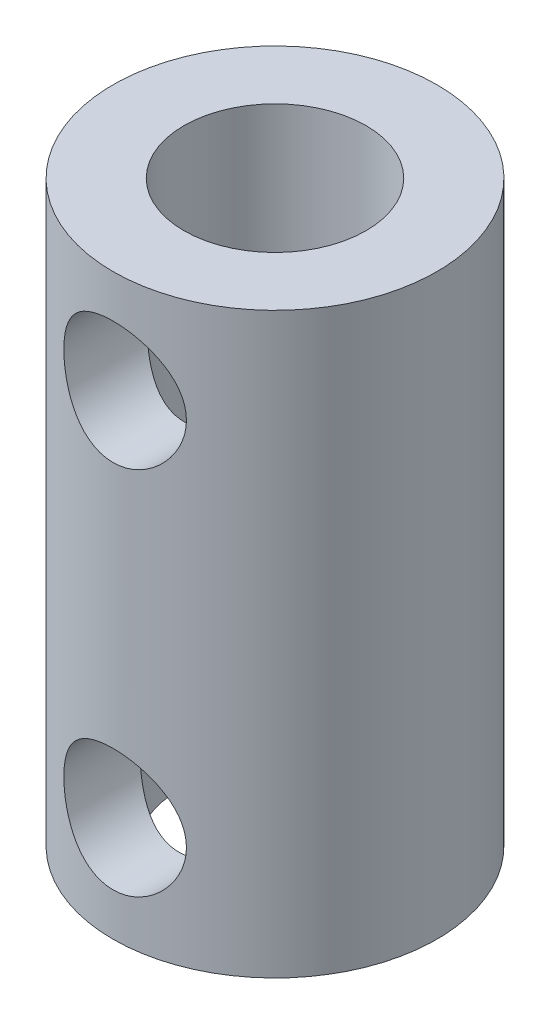
ISO-10303-21;
HEADER;
FILE_DESCRIPTION(('STEP AP214'),'2;1');
FILE_NAME('part.step','',(''),(''),'','','');
FILE_SCHEMA(('AUTOMOTIVE_DESIGN { 1 0 10303 214 1 1 1 1 }'));
ENDSEC;
DATA;
#1=APPLICATION_CONTEXT('core data for automotive mechanical design processes');
#2=APPLICATION_PROTOCOL_DEFINITION('international standard','automotive_design',2000,#1);
#3=PRODUCT_CONTEXT('',#1,'mechanical');
#4=PRODUCT('Part','Part','',(#3));
#5=PRODUCT_RELATED_PRODUCT_CATEGORY('part','',(#4));
#6=PRODUCT_DEFINITION_FORMATION('','',#4);
#7=PRODUCT_DEFINITION_CONTEXT('part definition',#1,'design');
#8=PRODUCT_DEFINITION('design','',#6,#7);
#9=PRODUCT_DEFINITION_SHAPE('','',#8);
#10=(LENGTH_UNIT() NAMED_UNIT(*) SI_UNIT(.MILLI.,.METRE.));
#11=(NAMED_UNIT(*) PLANE_ANGLE_UNIT() SI_UNIT($,.RADIAN.));
#12=(NAMED_UNIT(*) SI_UNIT($,.STERADIAN.) SOLID_ANGLE_UNIT());
#13=UNCERTAINTY_MEASURE_WITH_UNIT(LENGTH_MEASURE(1.E-05),#10,'distance_accuracy_value','');
#14=(GEOMETRIC_REPRESENTATION_CONTEXT(3) GLOBAL_UNCERTAINTY_ASSIGNED_CONTEXT((#13)) GLOBAL_UNIT_ASSIGNED_CONTEXT((#10,
#11,#12)) REPRESENTATION_CONTEXT('',''));
#15=CARTESIAN_POINT('',(0.,0.,0.));
#16=DIRECTION('',(0.,0.,1.));
#17=DIRECTION('',(1.,0.,0.));
#18=AXIS2_PLACEMENT_3D('',#15,#16,#17);
#19=CARTESIAN_POINT('',(0.,19.05,0.));
#20=DIRECTION('',(0.,-1.,0.));
#21=DIRECTION('',(0.,0.,-1.));
#22=AXIS2_PLACEMENT_3D('',#19,#20,#21);
#23=CYLINDRICAL_SURFACE('',#22,5.334);
#24=CARTESIAN_POINT('',(2.01929999999999,3.429,4.93700146951568));
#25=CARTESIAN_POINT('',(2.01930447944565,3.53796644205671,4.93699724405046));
#26=CARTESIAN_POINT('',(2.01045059439056,3.64690370553361,4.94064814854933));
#27=CARTESIAN_POINT('',(1.97543444054489,3.86148882864372,4.95475201963925));
#28=CARTESIAN_POINT('',(1.94927294682313,3.96713683535452,4.96520468163385));
#29=CARTESIAN_POINT('',(1.88074304619809,4.17198278347489,4.99156194094386));
#30=CARTESIAN_POINT('',(1.83841414033231,4.2711957615293,5.00745324054417));
#31=CARTESIAN_POINT('',(1.73889128334471,4.46115102344321,5.04287560500619));
#32=CARTESIAN_POINT('',(1.6816927775262,4.55189070025616,5.06240778458365));
#33=CARTESIAN_POINT('',(1.55095007886271,4.7269220295397,5.1040199433203));
#34=CARTESIAN_POINT('',(1.47677408325426,4.81072382075372,5.12617585427608));
#35=CARTESIAN_POINT('',(1.31552180232293,4.96504478705856,5.16990629793248));
#36=CARTESIAN_POINT('',(1.22844270450761,5.0355610586704,5.19148070266726));
#37=CARTESIAN_POINT('',(1.04012523794396,5.16368183766763,5.23252204526852));
#38=CARTESIAN_POINT('',(0.938499803257828,5.22075210244006,5.25188961400418));
#39=CARTESIAN_POINT('',(0.726227423158126,5.31678227445568,5.28542063488425));
#40=CARTESIAN_POINT('',(0.615583687488662,5.35574859235797,5.29958592879611));
#41=CARTESIAN_POINT('',(0.393566749542693,5.41274137724498,5.32057718322424));
#42=CARTESIAN_POINT('',(0.282438553669896,5.43161158643117,5.32769789450095));
#43=CARTESIAN_POINT('',(0.0583798398278732,5.45058184692518,5.33485652895422));
#44=CARTESIAN_POINT('',(-0.0545500684528995,5.45068811853213,5.33489679931724));
#45=CARTESIAN_POINT('',(-0.272951762873949,5.43261481136873,5.32807636219454));
#46=CARTESIAN_POINT('',(-0.378512558081566,5.41535666378981,5.32156339727964));
#47=CARTESIAN_POINT('',(-0.585111251091155,5.36459681820008,5.30282614548131));
#48=CARTESIAN_POINT('',(-0.686148827388547,5.33109396753274,5.29060145331974));
#49=CARTESIAN_POINT('',(-0.882591199788239,5.24837714092317,5.26142589156488));
#50=CARTESIAN_POINT('',(-0.977891853376849,5.19894029486581,5.24440843901689));
#51=CARTESIAN_POINT('',(-1.15908281530852,5.08595760716204,5.20736477295068));
#52=CARTESIAN_POINT('',(-1.24497004337341,5.02240716770396,5.18733757963256));
#53=CARTESIAN_POINT('',(-1.41031734945089,4.87858128309122,5.14492730665769));
#54=CARTESIAN_POINT('',(-1.48909060289719,4.79753549367529,5.12247495361345));
#55=CARTESIAN_POINT('',(-1.63218972233639,4.62325577623301,5.07869327063848));
#56=CARTESIAN_POINT('',(-1.69651181554814,4.53001867543433,5.05736423508365));
#57=CARTESIAN_POINT('',(-1.81023010786301,4.33124303399592,5.01780263958016));
#58=CARTESIAN_POINT('',(-1.85924901990288,4.22547089829707,4.99965257367589));
#59=CARTESIAN_POINT('',(-1.93851753880741,4.00630460921826,4.96945937974622));
#60=CARTESIAN_POINT('',(-1.96877783080307,3.89291483581017,4.95741277583277));
#61=CARTESIAN_POINT('',(-2.0080927254921,3.66852916571396,4.94161372576153));
#62=CARTESIAN_POINT('',(-2.01824049485177,3.55775511724918,4.93743437273379));
#63=CARTESIAN_POINT('',(-2.02020093934924,3.33603239846786,4.93663342024542));
#64=CARTESIAN_POINT('',(-2.01201832383527,3.22508378031911,4.94000987958409));
#65=CARTESIAN_POINT('',(-1.97854205652086,3.01183186914766,4.95350589275915));
#66=CARTESIAN_POINT('',(-1.95410194104481,2.90937078397479,4.96328872527596));
#67=CARTESIAN_POINT('',(-1.88988298600506,2.71005348440488,4.98809328378995));
#68=CARTESIAN_POINT('',(-1.85010096750629,2.61319843639933,5.00311609548081));
#69=CARTESIAN_POINT('',(-1.75463072385412,2.42375373533398,5.03740860205377));
#70=CARTESIAN_POINT('',(-1.69839621410485,2.3314653892027,5.05681781536739));
#71=CARTESIAN_POINT('',(-1.57219523321136,2.15724747101338,5.09746480725639));
#72=CARTESIAN_POINT('',(-1.50222365366067,2.07532177120689,5.11870326441882));
#73=CARTESIAN_POINT('',(-1.34516894631352,1.91864380219287,5.16227937258415));
#74=CARTESIAN_POINT('',(-1.25727058071108,1.84470087388889,5.18459902436317));
#75=CARTESIAN_POINT('',(-1.06976739053702,1.71251372859965,5.22650650196036));
#76=CARTESIAN_POINT('',(-0.970162473418255,1.65426963573486,5.24609430617899));
#77=CARTESIAN_POINT('',(-0.762084546055994,1.55549649159357,5.28032694944767));
#78=CARTESIAN_POINT('',(-0.653639678197281,1.51491364331945,5.29498676788628));
#79=CARTESIAN_POINT('',(-0.430779322695875,1.45280032542776,5.31775366325145));
#80=CARTESIAN_POINT('',(-0.316366729446474,1.43126070903253,5.32586388589443));
#81=CARTESIAN_POINT('',(-0.0921269840688139,1.40884562792458,5.33431446661301));
#82=CARTESIAN_POINT('',(0.0175700260696672,1.40682107157147,5.33508685186249));
#83=CARTESIAN_POINT('',(0.235675890355791,1.42052681410102,5.32990684279753));
#84=CARTESIAN_POINT('',(0.344084903230242,1.43625490180729,5.32395528598201));
#85=CARTESIAN_POINT('',(0.553754325491232,1.48421010250464,5.3061959436016));
#86=CARTESIAN_POINT('',(0.65512610504446,1.5160107376975,5.29453976881732));
#87=CARTESIAN_POINT('',(0.851099804673821,1.594780504935,5.26659215506921));
#88=CARTESIAN_POINT('',(0.945700438435498,1.64175250979098,5.2502998382871));
#89=CARTESIAN_POINT('',(1.12984126460486,1.75179421046231,5.21384686801513));
#90=CARTESIAN_POINT('',(1.21899691290268,1.81546192263802,5.19355150342232));
#91=CARTESIAN_POINT('',(1.38571137675006,1.9561510808879,5.15157869080139));
#92=CARTESIAN_POINT('',(1.46326600313846,2.03317732918966,5.1299007475314));
#93=CARTESIAN_POINT('',(1.60889417238222,2.20334295835456,5.08616858438968));
#94=CARTESIAN_POINT('',(1.67622898493519,2.29712810269221,5.06415732477682));
#95=CARTESIAN_POINT('',(1.79422016325732,2.49537615296483,5.02356822261871));
#96=CARTESIAN_POINT('',(1.84487417660335,2.59984056223187,5.0049908645041));
#97=CARTESIAN_POINT('',(1.92989734602869,2.82239312636753,4.97285117373348));
#98=CARTESIAN_POINT('',(1.96328114135574,2.94090744590317,4.9596003647767));
#99=CARTESIAN_POINT('',(2.00797225124147,3.18262915575414,4.94168088836879));
#100=CARTESIAN_POINT('',(2.01929493679981,3.30583321744351,4.93700624563709));
#101=CARTESIAN_POINT('',(2.01929999999999,3.429,4.93700146951568));
#102=B_SPLINE_CURVE_WITH_KNOTS('',3,(#24,#25,#26,#27,#28,#29,#30,#31,#32,#33,#34,#35,#36,#37,
#38,#39,#40,#41,#42,#43,#44,#45,#46,#47,#48,#49,#50,#51,#52,#53,#54,#55,#56,#57,#58,#59,#60,#61,
#62,#63,#64,#65,#66,#67,#68,#69,#70,#71,#72,#73,#74,#75,#76,#77,#78,#79,#80,#81,#82,#83,#84,#85,
#86,#87,#88,#89,#90,#91,#92,#93,#94,#95,#96,#97,#98,#99,#100,#101),.UNSPECIFIED.,.T.,.F.,(4,2,2,
2,2,2,2,2,2,2,2,2,2,2,2,2,2,2,2,2,2,2,2,2,2,2,2,2,2,2,2,2,2,2,2,2,2,2,4),(0.,0.326440462933104,
0.652866308208239,0.97849966296616,1.30423288001533,1.64497726295524,1.98579602758814,
2.33846601182069,2.69101101924979,3.02808777213957,3.36505278290879,3.68503301877184,
4.00503596242417,4.32972461584071,4.65451919925019,4.99864582719999,5.34286219255829,
5.69499486283584,6.0469267694459,6.37913973630183,6.71126736249901,7.02720512429604,
7.34320838551137,7.6712024554679,7.99931872846167,8.3487060328166,8.69809609946859,
9.04641432838319,9.39456516328478,9.72208120206034,10.0495564516543,10.3687657960398,
10.6880356205532,11.0208403418839,11.3537649513074,11.7046787209908,12.0556419573988,
12.4248810015916,12.793862687667),.UNSPECIFIED.);
#103=CARTESIAN_POINT('',(2.01929999999999,3.429,4.93700146951568));
#104=VERTEX_POINT('',#103);
#105=EDGE_CURVE('E118',#104,#104,#102,.T.);
#106=ORIENTED_EDGE('',*,*,#105,.F.);
#107=EDGE_LOOP('',(#106));
#108=FACE_BOUND('',#107,.T.);
#109=CARTESIAN_POINT('',(2.01929999999999,15.621,4.93700146951568));
#110=CARTESIAN_POINT('',(2.01930447944565,15.7299664420567,4.93699724405046));
#111=CARTESIAN_POINT('',(2.01045059439056,15.8389037055336,4.94064814854933));
#112=CARTESIAN_POINT('',(1.97543444054489,16.0534888286437,4.95475201963925));
#113=CARTESIAN_POINT('',(1.94927294682313,16.1591368353545,4.96520468163385));
#114=CARTESIAN_POINT('',(1.88074304619809,16.3639827834749,4.99156194094386));
#115=CARTESIAN_POINT('',(1.83841414033231,16.4631957615293,5.00745324054417));
#116=CARTESIAN_POINT('',(1.73889128334471,16.6531510234432,5.04287560500619));
#117=CARTESIAN_POINT('',(1.68169277752621,16.7438907002562,5.06240778458365));
#118=CARTESIAN_POINT('',(1.55095007886271,16.9189220295397,5.1040199433203));
#119=CARTESIAN_POINT('',(1.47677408325426,17.0027238207537,5.12617585427608));
#120=CARTESIAN_POINT('',(1.31552180232293,17.1570447870586,5.16990629793248));
#121=CARTESIAN_POINT('',(1.22844270450761,17.2275610586704,5.19148070266726));
#122=CARTESIAN_POINT('',(1.04012523794396,17.3556818376676,5.23252204526852));
#123=CARTESIAN_POINT('',(0.938499803257828,17.4127521024401,5.25188961400418));
#124=CARTESIAN_POINT('',(0.726227423158126,17.5087822744557,5.28542063488425));
#125=CARTESIAN_POINT('',(0.615583687488663,17.547748592358,5.29958592879611));
#126=CARTESIAN_POINT('',(0.393566749542694,17.604741377245,5.32057718322424));
#127=CARTESIAN_POINT('',(0.282438553669896,17.6236115864312,5.32769789450095));
#128=CARTESIAN_POINT('',(0.0583798398278735,17.6425818469252,5.33485652895422));
#129=CARTESIAN_POINT('',(-0.0545500684528993,17.6426881185321,5.33489679931724));
#130=CARTESIAN_POINT('',(-0.272951762873949,17.6246148113687,5.32807636219454));
#131=CARTESIAN_POINT('',(-0.378512558081566,17.6073566637898,5.32156339727964));
#132=CARTESIAN_POINT('',(-0.585111251091155,17.5565968182001,5.30282614548131));
#133=CARTESIAN_POINT('',(-0.686148827388547,17.5230939675327,5.29060145331974));
#134=CARTESIAN_POINT('',(-0.882591199788239,17.4403771409232,5.26142589156488));
#135=CARTESIAN_POINT('',(-0.977891853376849,17.3909402948658,5.24440843901689));
#136=CARTESIAN_POINT('',(-1.15908281530852,17.277957607162,5.20736477295068));
#137=CARTESIAN_POINT('',(-1.24497004337341,17.214407167704,5.18733757963256));
#138=CARTESIAN_POINT('',(-1.41031734945089,17.0705812830912,5.14492730665769));
#139=CARTESIAN_POINT('',(-1.48909060289719,16.9895354936753,5.12247495361345));
#140=CARTESIAN_POINT('',(-1.63218972233639,16.815255776233,5.07869327063848));
#141=CARTESIAN_POINT('',(-1.69651181554814,16.7220186754343,5.05736423508365));
#142=CARTESIAN_POINT('',(-1.81023010786301,16.5232430339959,5.01780263958016));
#143=CARTESIAN_POINT('',(-1.85924901990288,16.4174708982971,4.99965257367589));
#144=CARTESIAN_POINT('',(-1.93851753880741,16.1983046092183,4.96945937974622));
#145=CARTESIAN_POINT('',(-1.96877783080307,16.0849148358102,4.95741277583277));
#146=CARTESIAN_POINT('',(-2.0080927254921,15.860529165714,4.94161372576153));
#147=CARTESIAN_POINT('',(-2.01824049485177,15.7497551172492,4.93743437273379));
#148=CARTESIAN_POINT('',(-2.02020093934924,15.5280323984679,4.93663342024542));
#149=CARTESIAN_POINT('',(-2.01201832383527,15.4170837803191,4.94000987958409));
#150=CARTESIAN_POINT('',(-1.97854205652086,15.2038318691477,4.95350589275915));
#151=CARTESIAN_POINT('',(-1.95410194104481,15.1013707839748,4.96328872527596));
#152=CARTESIAN_POINT('',(-1.88988298600506,14.9020534844049,4.98809328378994));
#153=CARTESIAN_POINT('',(-1.85010096750629,14.8051984363993,5.00311609548081));
#154=CARTESIAN_POINT('',(-1.75463072385412,14.615753735334,5.03740860205378));
#155=CARTESIAN_POINT('',(-1.69839621410485,14.5234653892027,5.05681781536739));
#156=CARTESIAN_POINT('',(-1.57219523321136,14.3492474710134,5.09746480725639));
#157=CARTESIAN_POINT('',(-1.50222365366067,14.2673217712069,5.11870326441882));
#158=CARTESIAN_POINT('',(-1.34516894631353,14.1106438021929,5.16227937258415));
#159=CARTESIAN_POINT('',(-1.25727058071108,14.0367008738889,5.18459902436317));
#160=CARTESIAN_POINT('',(-1.06976739053702,13.9045137285996,5.22650650196036));
#161=CARTESIAN_POINT('',(-0.970162473418256,13.8462696357349,5.24609430617899));
#162=CARTESIAN_POINT('',(-0.762084546055995,13.7474964915936,5.28032694944767));
#163=CARTESIAN_POINT('',(-0.653639678197281,13.7069136433194,5.29498676788628));
#164=CARTESIAN_POINT('',(-0.430779322695875,13.6448003254278,5.31775366325145));
#165=CARTESIAN_POINT('',(-0.316366729446475,13.6232607090325,5.32586388589443));
#166=CARTESIAN_POINT('',(-0.0921269840688147,13.6008456279246,5.33431446661301));
#167=CARTESIAN_POINT('',(0.0175700260696663,13.5988210715715,5.33508685186249));
#168=CARTESIAN_POINT('',(0.23567589035579,13.612526814101,5.32990684279753));
#169=CARTESIAN_POINT('',(0.344084903230241,13.6282549018073,5.32395528598201));
#170=CARTESIAN_POINT('',(0.553754325491232,13.6762101025046,5.3061959436016));
#171=CARTESIAN_POINT('',(0.655126105044459,13.7080107376975,5.29453976881732));
#172=CARTESIAN_POINT('',(0.851099804673821,13.786780504935,5.26659215506921));
#173=CARTESIAN_POINT('',(0.945700438435498,13.833752509791,5.2502998382871));
#174=CARTESIAN_POINT('',(1.12984126460486,13.9437942104623,5.21384686801513));
#175=CARTESIAN_POINT('',(1.21899691290268,14.007461922638,5.19355150342232));
#176=CARTESIAN_POINT('',(1.38571137675006,14.1481510808879,5.15157869080139));
#177=CARTESIAN_POINT('',(1.46326600313847,14.2251773291897,5.1299007475314));
#178=CARTESIAN_POINT('',(1.60889417238223,14.3953429583546,5.08616858438968));
#179=CARTESIAN_POINT('',(1.67622898493519,14.4891281026922,5.06415732477682));
#180=CARTESIAN_POINT('',(1.79422016325732,14.6873761529648,5.02356822261871));
#181=CARTESIAN_POINT('',(1.84487417660335,14.7918405622319,5.0049908645041));
#182=CARTESIAN_POINT('',(1.92989734602869,15.0143931263675,4.97285117373348));
#183=CARTESIAN_POINT('',(1.96328114135574,15.1329074459032,4.9596003647767));
#184=CARTESIAN_POINT('',(2.00797225124147,15.3746291557541,4.94168088836879));
#185=CARTESIAN_POINT('',(2.01929493679981,15.4978332174435,4.93700624563709));
#186=CARTESIAN_POINT('',(2.01929999999999,15.621,4.93700146951568));
#187=B_SPLINE_CURVE_WITH_KNOTS('',3,(#109,#110,#111,#112,#113,#114,#115,#116,#117,#118,#119,
#120,#121,#122,#123,#124,#125,#126,#127,#128,#129,#130,#131,#132,#133,#134,#135,#136,#137,#138,
#139,#140,#141,#142,#143,#144,#145,#146,#147,#148,#149,#150,#151,#152,#153,#154,#155,#156,#157,
#158,#159,#160,#161,#162,#163,#164,#165,#166,#167,#168,#169,#170,#171,#172,#173,#174,#175,#176,
#177,#178,#179,#180,#181,#182,#183,#184,#185,#186),.UNSPECIFIED.,.T.,.F.,(4,2,2,2,2,2,2,2,2,2,2,
2,2,2,2,2,2,2,2,2,2,2,2,2,2,2,2,2,2,2,2,2,2,2,2,2,2,2,4),(0.,0.326440462933099,
0.652866308208239,0.978499662966158,1.30423288001532,1.64497726295524,1.98579602758814,
2.33846601182069,2.69101101924979,3.02808777213957,3.36505278290879,3.68503301877184,
4.00503596242417,4.32972461584071,4.65451919925019,4.99864582719999,5.34286219255829,
5.69499486283584,6.04692676944589,6.37913973630183,6.71126736249901,7.02720512429604,
7.34320838551137,7.6712024554679,7.99931872846166,8.3487060328166,8.69809609946859,
9.04641432838319,9.39456516328478,9.72208120206034,10.0495564516543,10.3687657960398,
10.6880356205532,11.0208403418839,11.3537649513074,11.7046787209908,12.0556419573988,
12.4248810015916,12.793862687667),.UNSPECIFIED.);
#188=CARTESIAN_POINT('',(2.01929999999999,15.621,4.93700146951568));
#189=VERTEX_POINT('',#188);
#190=EDGE_CURVE('E59',#189,#189,#187,.T.);
#191=ORIENTED_EDGE('',*,*,#190,.F.);
#192=EDGE_LOOP('',(#191));
#193=FACE_BOUND('',#192,.T.);
#194=CARTESIAN_POINT('',(0.,19.05,0.));
#195=DIRECTION('',(0.,-1.,0.));
#196=DIRECTION('',(0.,0.,-1.));
#197=AXIS2_PLACEMENT_3D('',#194,#195,#196);
#198=CIRCLE('',#197,5.334);
#199=CARTESIAN_POINT('',(0.,19.05,-5.334));
#200=VERTEX_POINT('',#199);
#201=EDGE_CURVE('E10',#200,#200,#198,.T.);
#202=ORIENTED_EDGE('',*,*,#201,.T.);
#203=EDGE_LOOP('',(#202));
#204=FACE_BOUND('',#203,.T.);
#205=CARTESIAN_POINT('',(0.,0.,0.));
#206=DIRECTION('',(0.,-1.,0.));
#207=DIRECTION('',(0.,0.,-1.));
#208=AXIS2_PLACEMENT_3D('',#205,#206,#207);
#209=CIRCLE('',#208,5.334);
#210=CARTESIAN_POINT('',(0.,0.,-5.334));
#211=VERTEX_POINT('',#210);
#212=EDGE_CURVE('E40',#211,#211,#209,.T.);
#213=ORIENTED_EDGE('',*,*,#212,.F.);
#214=EDGE_LOOP('',(#213));
#215=FACE_BOUND('',#214,.T.);
#216=ADVANCED_FACE('F33',(#108,#193,#204,#215),#23,.T.);
#217=CARTESIAN_POINT('',(5.334,19.05,0.));
#218=DIRECTION('',(0.,1.,0.));
#219=DIRECTION('',(0.,0.,1.));
#220=AXIS2_PLACEMENT_3D('',#217,#218,#219);
#221=PLANE('',#220);
#222=CARTESIAN_POINT('',(0.,19.05,0.));
#223=DIRECTION('',(0.,-1.,0.));
#224=DIRECTION('',(0.,0.,-1.));
#225=AXIS2_PLACEMENT_3D('',#222,#223,#224);
#226=CIRCLE('',#225,3.);
#227=CARTESIAN_POINT('',(0.,19.05,-3.));
#228=VERTEX_POINT('',#227);
#229=EDGE_CURVE('E44',#228,#228,#226,.T.);
#230=ORIENTED_EDGE('',*,*,#229,.T.);
#231=EDGE_LOOP('',(#230));
#232=FACE_BOUND('',#231,.T.);
#233=ORIENTED_EDGE('',*,*,#201,.F.);
#234=EDGE_LOOP('',(#233));
#235=FACE_BOUND('',#234,.T.);
#236=ADVANCED_FACE('F95',(#232,#235),#221,.T.);
#237=CARTESIAN_POINT('',(0.,0.,0.));
#238=DIRECTION('',(0.,-1.,0.));
#239=DIRECTION('',(0.,0.,-1.));
#240=AXIS2_PLACEMENT_3D('',#237,#238,#239);
#241=PLANE('',#240);
#242=CARTESIAN_POINT('',(0.,0.,0.));
#243=DIRECTION('',(0.,-1.,0.));
#244=DIRECTION('',(0.,0.,-1.));
#245=AXIS2_PLACEMENT_3D('',#242,#243,#244);
#246=CIRCLE('',#245,3.17499999999999);
#247=CARTESIAN_POINT('',(0.,0.,-3.17499999999999));
#248=VERTEX_POINT('',#247);
#249=EDGE_CURVE('E56',#248,#248,#246,.T.);
#250=ORIENTED_EDGE('',*,*,#249,.F.);
#251=EDGE_LOOP('',(#250));
#252=FACE_BOUND('',#251,.T.);
#253=ORIENTED_EDGE('',*,*,#212,.T.);
#254=EDGE_LOOP('',(#253));
#255=FACE_BOUND('',#254,.T.);
#256=ADVANCED_FACE('F92',(#252,#255),#241,.T.);
#257=CARTESIAN_POINT('',(0.,0.,0.));
#258=DIRECTION('',(0.,-1.,0.));
#259=DIRECTION('',(0.,0.,-1.));
#260=AXIS2_PLACEMENT_3D('',#257,#258,#259);
#261=CYLINDRICAL_SURFACE('',#260,3.);
#262=CARTESIAN_POINT('',(2.01929999999999,15.621,2.21865443681526));
#263=CARTESIAN_POINT('',(2.01929557056704,15.7192671401592,2.21866234256912));
#264=CARTESIAN_POINT('',(2.01206483245342,15.8175603407175,2.22530505153962));
#265=CARTESIAN_POINT('',(1.98377062539098,16.0106043957588,2.2505522842828));
#266=CARTESIAN_POINT('',(1.96268195378143,16.1053484631655,2.26917860068805));
#267=CARTESIAN_POINT('',(1.90835838296158,16.287884459705,2.31503857852307));
#268=CARTESIAN_POINT('',(1.87524440577662,16.3757353652416,2.34218619651473));
#269=CARTESIAN_POINT('',(1.79815680037773,16.544482005054,2.40187573162484));
#270=CARTESIAN_POINT('',(1.75418118840454,16.6253764651683,2.43441863377582));
#271=CARTESIAN_POINT('',(1.64848495005426,16.7920235854983,2.50743840753541));
#272=CARTESIAN_POINT('',(1.58505386225392,16.8764994235881,2.54835357817396));
#273=CARTESIAN_POINT('',(1.44570417067942,17.0347318737243,2.62991889181378));
#274=CARTESIAN_POINT('',(1.36977185410015,17.1084765453415,2.67056869224428));
#275=CARTESIAN_POINT('',(1.19397121055005,17.2540618314404,2.75413418677317));
#276=CARTESIAN_POINT('',(1.09222247546914,17.3239866544515,2.79648714313045));
#277=CARTESIAN_POINT('',(0.875040401298355,17.4450754370699,2.8718350979234));
#278=CARTESIAN_POINT('',(0.759632572119355,17.4962736611851,2.90484716229016));
#279=CARTESIAN_POINT('',(0.549008685657062,17.5665593679438,2.95078332389357));
#280=CARTESIAN_POINT('',(0.456043763684412,17.5904892209333,2.96667415060401));
#281=CARTESIAN_POINT('',(0.266614414394866,17.6249293511286,2.98964729780215));
#282=CARTESIAN_POINT('',(0.170152699276886,17.6354498092669,2.99673630086966));
#283=CARTESIAN_POINT('',(-0.0236726743082403,17.6424929049782,3.00147540210168));
#284=CARTESIAN_POINT('',(-0.12103754290406,17.6389927876243,2.99911015634872));
#285=CARTESIAN_POINT('',(-0.313599740557854,17.6181510946223,2.98512667355241));
#286=CARTESIAN_POINT('',(-0.408796419060934,17.6008054195195,2.97350569603281));
#287=CARTESIAN_POINT('',(-0.592831201364783,17.5536151170882,2.94229892606819));
#288=CARTESIAN_POINT('',(-0.681750349949286,17.5239899261639,2.92285313389554));
#289=CARTESIAN_POINT('',(-0.853221247278163,17.4535357609794,2.87747980480934));
#290=CARTESIAN_POINT('',(-0.93577178789795,17.4127046676226,2.85155104201361));
#291=CARTESIAN_POINT('',(-1.10224890501396,17.3159653746108,2.79172464226938));
#292=CARTESIAN_POINT('',(-1.1852816741221,17.2588764603106,2.75725819408421));
#293=CARTESIAN_POINT('',(-1.34116728217443,17.133892599233,2.68489723426377));
#294=CARTESIAN_POINT('',(-1.41400799661008,17.0659849843491,2.64699872660909));
#295=CARTESIAN_POINT('',(-1.5600254978507,16.9083565370899,2.56407475820383));
#296=CARTESIAN_POINT('',(-1.63124388122827,16.8168861931617,2.51891215602185));
#297=CARTESIAN_POINT('',(-1.75766909894408,16.6218292624233,2.4323774557307));
#298=CARTESIAN_POINT('',(-1.81288587103558,16.5182502520077,2.3910030159647));
#299=CARTESIAN_POINT('',(-1.89435554589857,16.3260760191364,2.32668160855976));
#300=CARTESIAN_POINT('',(-1.92437331692648,16.2397711871623,2.30169212875083));
#301=CARTESIAN_POINT('',(-1.97269897085656,16.0620012590557,2.26041566726755));
#302=CARTESIAN_POINT('',(-1.99102802835372,15.9705458225626,2.24411295800861));
#303=CARTESIAN_POINT('',(-2.0149303622607,15.7838871887504,2.222686533534));
#304=CARTESIAN_POINT('',(-2.02040400592856,15.6886604975433,2.21765014939079));
#305=CARTESIAN_POINT('',(-2.01782418156476,15.4985392676999,2.21999709948592));
#306=CARTESIAN_POINT('',(-2.009769482597,15.4036447600761,2.22738156389021));
#307=CARTESIAN_POINT('',(-1.9823600537659,15.2273839703655,2.25178260184983));
#308=CARTESIAN_POINT('',(-1.96429432021986,15.1456502810812,2.26769460562246));
#309=CARTESIAN_POINT('',(-1.91881441583121,14.98650445011,2.30630436250034));
#310=CARTESIAN_POINT('',(-1.89139187974783,14.9090962478468,2.32900818543345));
#311=CARTESIAN_POINT('',(-1.81393614418845,14.7259948974632,2.39019256686731));
#312=CARTESIAN_POINT('',(-1.75927398772387,14.6230979439869,2.43119190661199));
#313=CARTESIAN_POINT('',(-1.63412252576975,14.4291189228316,2.51702596964044));
#314=CARTESIAN_POINT('',(-1.56360438977375,14.3380588599021,2.56186758613671));
#315=CARTESIAN_POINT('',(-1.40690664534953,14.1678205180499,2.65119923348649));
#316=CARTESIAN_POINT('',(-1.32053808616176,14.0888092838162,2.69567741312341));
#317=CARTESIAN_POINT('',(-1.13388488895261,13.9459960012237,2.7793392955944));
#318=CARTESIAN_POINT('',(-1.03362298236647,13.8821695627154,2.81853144450142));
#319=CARTESIAN_POINT('',(-0.840004911999581,13.7820838189911,2.8814613460904));
#320=CARTESIAN_POINT('',(-0.748638284121978,13.7429329328074,2.90671031785808));
#321=CARTESIAN_POINT('',(-0.559408971732076,13.6781637235962,2.9489717437722));
#322=CARTESIAN_POINT('',(-0.461550525440026,13.6525366674537,2.96598951268576));
#323=CARTESIAN_POINT('',(-0.261426059236919,13.6161026682513,2.99029330371236));
#324=CARTESIAN_POINT('',(-0.159142020830103,13.6053636442399,2.99753472231491));
#325=CARTESIAN_POINT('',(0.0460675418295133,13.5996196200381,3.00139969682055));
#326=CARTESIAN_POINT('',(0.148992957307122,13.6046120206402,2.99802500675873));
#327=CARTESIAN_POINT('',(0.344233100217078,13.6290121628386,2.98167275995444));
#328=CARTESIAN_POINT('',(0.436757639037991,13.6472892135256,2.96944870576322));
#329=CARTESIAN_POINT('',(0.617100529798052,13.6960349956549,2.93727483290707));
#330=CARTESIAN_POINT('',(0.704918125587402,13.7265056793341,2.91732377714257));
#331=CARTESIAN_POINT('',(0.878783022761484,13.8003622055902,2.8698961329431));
#332=CARTESIAN_POINT('',(0.964469954097767,13.8443639900266,2.84206722872816));
#333=CARTESIAN_POINT('',(1.12748988023206,13.9430746738323,2.78142848711393));
#334=CARTESIAN_POINT('',(1.20481810898478,13.9977896322794,2.74861583340875));
#335=CARTESIAN_POINT('',(1.36187324469398,14.1261007178187,2.67469083929216));
#336=CARTESIAN_POINT('',(1.4400468044398,14.2013143032616,2.63308646360291));
#337=CARTESIAN_POINT('',(1.58338763651023,14.3631618109861,2.54946543540449));
#338=CARTESIAN_POINT('',(1.64854429586144,14.449804957269,2.50744847554961));
#339=CARTESIAN_POINT('',(1.76112586753633,14.6278276735111,2.42957182040482));
#340=CARTESIAN_POINT('',(1.80940947124401,14.7185646363821,2.39349096481954));
#341=CARTESIAN_POINT('',(1.89224134230134,14.9084829339211,2.32856168398022));
#342=CARTESIAN_POINT('',(1.92681428683718,15.0076487035679,2.29970029963397));
#343=CARTESIAN_POINT('',(1.97508614901329,15.1922799695717,2.25828361956565));
#344=CARTESIAN_POINT('',(1.99157304757175,15.2765332198064,2.24362420365402));
#345=CARTESIAN_POINT('',(2.013676069828,15.4475193935474,2.22381124536044));
#346=CARTESIAN_POINT('',(2.01930391031362,15.534249541819,2.21864745759751));
#347=CARTESIAN_POINT('',(2.01929999999999,15.621,2.21865443681526));
#348=B_SPLINE_CURVE_WITH_KNOTS('',3,(#262,#263,#264,#265,#266,#267,#268,#269,#270,#271,#272,
#273,#274,#275,#276,#277,#278,#279,#280,#281,#282,#283,#284,#285,#286,#287,#288,#289,#290,#291,
#292,#293,#294,#295,#296,#297,#298,#299,#300,#301,#302,#303,#304,#305,#306,#307,#308,#309,#310,
#311,#312,#313,#314,#315,#316,#317,#318,#319,#320,#321,#322,#323,#324,#325,#326,#327,#328,#329,
#330,#331,#332,#333,#334,#335,#336,#337,#338,#339,#340,#341,#342,#343,#344,#345,#346,#347),
.UNSPECIFIED.,.T.,.F.,(4,2,2,2,2,2,2,2,2,2,2,2,2,2,2,2,2,2,2,2,2,2,2,2,2,2,2,2,2,2,2,2,2,2,2,2,
2,2,2,2,2,2,4),(0.,0.294403536380049,0.589343975595895,0.881397200780216,1.17350380579788,
1.51211387476106,1.85109787614565,2.24051778682945,2.62922155934115,2.91986353918583,
3.2102847206695,3.50117743686839,3.79215631384675,4.0781454004206,4.3641886063847,
4.68247532658298,5.00113752008123,5.37279099606918,5.74421316067909,6.02735164683165,
6.30997574768518,6.59478313131644,6.87961643081159,7.13424228210729,7.38909637504131,
7.75770005887127,8.12697946404343,8.50098664778863,8.87438897473931,9.18078287749253,
9.48697868121591,9.79456680098561,10.1021041025096,10.3861411287428,10.6702236483578,
10.9698648671405,11.269676046877,11.6168834583151,11.9643728107565,12.2899631035632,
12.6149646923712,12.8751457033016,13.1350458248448),.UNSPECIFIED.);
#349=CARTESIAN_POINT('',(2.01929999999999,15.621,2.21865443681526));
#350=VERTEX_POINT('',#349);
#351=EDGE_CURVE('E65',#350,#350,#348,.T.);
#352=ORIENTED_EDGE('',*,*,#351,.T.);
#353=EDGE_LOOP('',(#352));
#354=FACE_BOUND('',#353,.T.);
#355=ORIENTED_EDGE('',*,*,#229,.F.);
#356=EDGE_LOOP('',(#355));
#357=FACE_BOUND('',#356,.T.);
#358=CARTESIAN_POINT('',(0.,9.63015060827538,0.));
#359=DIRECTION('',(0.,-1.,0.));
#360=DIRECTION('',(0.,0.,-1.));
#361=AXIS2_PLACEMENT_3D('',#358,#359,#360);
#362=CIRCLE('',#361,3.00000000000001);
#363=CARTESIAN_POINT('',(0.,9.63015060827538,-3.00000000000001));
#364=VERTEX_POINT('',#363);
#365=EDGE_CURVE('E48',#364,#364,#362,.T.);
#366=ORIENTED_EDGE('',*,*,#365,.T.);
#367=EDGE_LOOP('',(#366));
#368=FACE_BOUND('',#367,.T.);
#369=ADVANCED_FACE('F88',(#354,#357,#368),#261,.F.);
#370=CARTESIAN_POINT('',(0.,9.52499999999999,0.));
#371=DIRECTION('',(0.,-1.,0.));
#372=DIRECTION('',(0.,0.,-1.));
#373=AXIS2_PLACEMENT_3D('',#370,#371,#372);
#374=CONICAL_SURFACE('',#373,3.17499999999998,1.02974425890514);
#375=ORIENTED_EDGE('',*,*,#365,.F.);
#376=EDGE_LOOP('',(#375));
#377=FACE_BOUND('',#376,.T.);
#378=CARTESIAN_POINT('',(0.,9.52499999999999,0.));
#379=DIRECTION('',(0.,-1.,0.));
#380=DIRECTION('',(0.,0.,-1.));
#381=AXIS2_PLACEMENT_3D('',#378,#379,#380);
#382=CIRCLE('',#381,3.17499999999998);
#383=CARTESIAN_POINT('',(0.,9.52499999999999,-3.17499999999998));
#384=VERTEX_POINT('',#383);
#385=EDGE_CURVE('E53',#384,#384,#382,.T.);
#386=ORIENTED_EDGE('',*,*,#385,.T.);
#387=EDGE_LOOP('',(#386));
#388=FACE_BOUND('',#387,.T.);
#389=ADVANCED_FACE('F84',(#377,#388),#374,.F.);
#390=CARTESIAN_POINT('',(0.,0.,0.));
#391=DIRECTION('',(0.,-1.,0.));
#392=DIRECTION('',(0.,0.,-1.));
#393=AXIS2_PLACEMENT_3D('',#390,#391,#392);
#394=CYLINDRICAL_SURFACE('',#393,3.17499999999999);
#395=CARTESIAN_POINT('',(2.01929999999999,3.429,2.45011275454823));
#396=CARTESIAN_POINT('',(2.01929051569735,3.52894127069753,2.45012817951551));
#397=CARTESIAN_POINT('',(2.01181623998909,3.628972329925,2.45634010720795));
#398=CARTESIAN_POINT('',(1.98248167673375,3.82557968147831,2.48006385016956));
#399=CARTESIAN_POINT('',(1.96059293748517,3.92214874208904,2.49759801227127));
#400=CARTESIAN_POINT('',(1.9040331603516,4.10843627589821,2.54096978697849));
#401=CARTESIAN_POINT('',(1.86947367457506,4.19820652404967,2.56673468951971));
#402=CARTESIAN_POINT('',(1.78888009345359,4.37056455142342,2.62353964875391));
#403=CARTESIAN_POINT('',(1.74284368975069,4.45315088122778,2.65458076625439));
#404=CARTESIAN_POINT('',(1.63312725242593,4.6214415102559,2.7236522095303));
#405=CARTESIAN_POINT('',(1.56788172310624,4.7059732450019,2.76205343085875));
#406=CARTESIAN_POINT('',(1.42479045231801,4.86389017756889,2.83851915466698));
#407=CARTESIAN_POINT('',(1.34693386567764,4.93726567508319,2.87658333731987));
#408=CARTESIAN_POINT('',(1.16891001207363,5.08000661538207,2.95378200389085));
#409=CARTESIAN_POINT('',(1.06716606271611,5.14768834305823,2.99244190742993));
#410=CARTESIAN_POINT('',(0.850805271225739,5.26441857889044,3.06097746101504));
#411=CARTESIAN_POINT('',(0.736201684957569,5.31348605031166,3.09086204386165));
#412=CARTESIAN_POINT('',(0.509994904354269,5.38605734525045,3.13566626418312));
#413=CARTESIAN_POINT('',(0.399328091275864,5.41169558748184,3.15182273437587));
#414=CARTESIAN_POINT('',(0.174221138396404,5.44397014691782,3.17222196724826));
#415=CARTESIAN_POINT('',(0.0597853025568793,5.45062742668431,3.17647787280314));
#416=CARTESIAN_POINT('',(-0.152424127581289,5.44493994541017,3.17286513938982));
#417=CARTESIAN_POINT('',(-0.250305470554213,5.43510476842585,3.16659762255068));
#418=CARTESIAN_POINT('',(-0.442698018208734,5.40159302412571,3.14547384128327));
#419=CARTESIAN_POINT('',(-0.537208968983372,5.37791541632401,3.13061693122204));
#420=CARTESIAN_POINT('',(-0.720612526879302,5.31781504253609,3.09356053401836));
#421=CARTESIAN_POINT('',(-0.809499492488895,5.2813797110953,3.07135380901375));
#422=CARTESIAN_POINT('',(-0.97994873920657,5.19714027782338,3.02129545312326));
#423=CARTESIAN_POINT('',(-1.06150944275225,5.14933373547795,2.99344261064513));
#424=CARTESIAN_POINT('',(-1.22606234754406,5.03694609088178,2.93020696894432));
#425=CARTESIAN_POINT('',(-1.30793132368399,4.97100822513682,2.89431735966663));
#426=CARTESIAN_POINT('',(-1.4601602295923,4.82773303530302,2.82059026986524));
#427=CARTESIAN_POINT('',(-1.53050270668808,4.75037875571948,2.78274994751953));
#428=CARTESIAN_POINT('',(-1.6675094809994,4.57403891610957,2.70316998021408));
#429=CARTESIAN_POINT('',(-1.73234677283065,4.47354168042348,2.66160715287758));
#430=CARTESIAN_POINT('',(-1.84401294040444,4.26060899617821,2.58550168350824));
#431=CARTESIAN_POINT('',(-1.89087460028104,4.14819576286591,2.55094631600008));
#432=CARTESIAN_POINT('',(-1.95422417089592,3.94536060127733,2.50255370083122));
#433=CARTESIAN_POINT('',(-1.97549340596571,3.85717038933683,2.48564302359112));
#434=CARTESIAN_POINT('',(-2.00601072185794,3.67752371563982,2.46108567735712));
#435=CARTESIAN_POINT('',(-2.01527635522342,3.58607222444306,2.45342548274736));
#436=CARTESIAN_POINT('',(-2.02122148552107,3.40221667144573,2.44853180042154));
#437=CARTESIAN_POINT('',(-2.01786621047328,3.30981067847947,2.45132711866524));
#438=CARTESIAN_POINT('',(-1.9987248225326,3.12713534005661,2.46695474139763));
#439=CARTESIAN_POINT('',(-1.98292831962279,3.03686784545298,2.4797954349997));
#440=CARTESIAN_POINT('',(-1.94035603763407,2.86293908196718,2.51323380479193));
#441=CARTESIAN_POINT('',(-1.91385485991129,2.77917087309287,2.53363649039045));
#442=CARTESIAN_POINT('',(-1.85093711433129,2.61710707475903,2.57995729521186));
#443=CARTESIAN_POINT('',(-1.8145172353892,2.53881332378446,2.60587725559256));
#444=CARTESIAN_POINT('',(-1.72468862869318,2.37378481532053,2.66637185156353));
#445=CARTESIAN_POINT('',(-1.66935511652756,2.28835645675552,2.70165014338979));
#446=CARTESIAN_POINT('',(-1.54684224267733,2.12702926072513,2.7736192169777));
#447=CARTESIAN_POINT('',(-1.47964890187628,2.05114185189078,2.81031162521156));
#448=CARTESIAN_POINT('',(-1.32146957597981,1.89750442417588,2.8884983153744));
#449=CARTESIAN_POINT('',(-1.22837765550165,1.82175420866531,2.92970866402264));
#450=CARTESIAN_POINT('',(-1.02843925094223,1.68705670958564,3.00571697609959));
#451=CARTESIAN_POINT('',(-0.921608355915266,1.62809062174494,3.04052210010587));
#452=CARTESIAN_POINT('',(-0.719216299701136,1.53957226245438,3.09386715213229));
#453=CARTESIAN_POINT('',(-0.625687670231277,1.50649343239506,3.11426889307067));
#454=CARTESIAN_POINT('',(-0.43344950645315,1.45426158788784,3.14677961976785));
#455=CARTESIAN_POINT('',(-0.334744157744078,1.43509750336512,3.15889519725593));
#456=CARTESIAN_POINT('',(-0.134549858045076,1.4116616455388,3.17373957805949));
#457=CARTESIAN_POINT('',(-0.0330532251289106,1.4074362316746,3.17643916020349));
#458=CARTESIAN_POINT('',(0.169220717606881,1.41425996732008,3.17210070452943));
#459=CARTESIAN_POINT('',(0.269997958742475,1.42531055621006,3.16506174909831));
#460=CARTESIAN_POINT('',(0.462903169338652,1.46114457582786,3.14250337260814));
#461=CARTESIAN_POINT('',(0.555213410179454,1.48523382787444,3.12741313735221));
#462=CARTESIAN_POINT('',(0.734262324128183,1.54555540013465,3.09028356911828));
#463=CARTESIAN_POINT('',(0.821000087055454,1.58178969808063,3.0682431043806));
#464=CARTESIAN_POINT('',(0.993896475754059,1.66837247564594,3.01687781461151));
#465=CARTESIAN_POINT('',(1.07948239570686,1.71960130435253,2.98711895257935));
#466=CARTESIAN_POINT('',(1.24128256073287,1.8331997608168,2.92359589755362));
#467=CARTESIAN_POINT('',(1.31748906326208,1.89557848984223,2.8898284401059));
#468=CARTESIAN_POINT('',(1.47048578378874,2.04048577966154,2.81541804007873));
#469=CARTESIAN_POINT('',(1.54561455035015,2.12463535064111,2.7745086160117));
#470=CARTESIAN_POINT('',(1.68123983029399,2.30484642528026,2.69448679509776));
#471=CARTESIAN_POINT('',(1.7417327961185,2.40091080844167,2.65537483579391));
#472=CARTESIAN_POINT('',(1.83876550837131,2.58877299516956,2.5889189732656));
#473=CARTESIAN_POINT('',(1.87752281278316,2.67910791563854,2.56069019061927));
#474=CARTESIAN_POINT('',(1.94182185539048,2.866300549675,2.51228784962042));
#475=CARTESIAN_POINT('',(1.96739877665448,2.9631401097825,2.49209287945081));
#476=CARTESIAN_POINT('',(1.99678820017445,3.12216120028776,2.46853356270054));
#477=CARTESIAN_POINT('',(2.00520384926546,3.18300506264097,2.46167383937579));
#478=CARTESIAN_POINT('',(2.01646293280567,3.30555447596037,2.45245846542434));
#479=CARTESIAN_POINT('',(2.01930585903946,3.36726010500031,2.45010322559335));
#480=CARTESIAN_POINT('',(2.01929999999999,3.429,2.45011275454823));
#481=B_SPLINE_CURVE_WITH_KNOTS('',3,(#395,#396,#397,#398,#399,#400,#401,#402,#403,#404,#405,
#406,#407,#408,#409,#410,#411,#412,#413,#414,#415,#416,#417,#418,#419,#420,#421,#422,#423,#424,
#425,#426,#427,#428,#429,#430,#431,#432,#433,#434,#435,#436,#437,#438,#439,#440,#441,#442,#443,
#444,#445,#446,#447,#448,#449,#450,#451,#452,#453,#454,#455,#456,#457,#458,#459,#460,#461,#462,
#463,#464,#465,#466,#467,#468,#469,#470,#471,#472,#473,#474,#475,#476,#477,#478,#479,#480),
.UNSPECIFIED.,.T.,.F.,(4,2,2,2,2,2,2,2,2,2,2,2,2,2,2,2,2,2,2,2,2,2,2,2,2,2,2,2,2,2,2,2,2,2,2,2,
2,2,2,2,2,2,4),(0.,0.299545346163702,0.599683723262749,0.897240786031993,1.19485774494705,
1.53399780499747,1.87343108015558,2.25583678812834,2.63785186753817,2.97997514749979,
3.32172044011373,3.61602438944011,3.91035046338391,4.20496724691204,4.49964731888725,
4.831591447703,5.16403363102356,5.54206146658145,5.9193965355226,6.19510071677626,
6.47040128648608,6.74646089414033,7.02275129165824,7.29236365357901,7.56206612870595,
7.88405755850047,8.20643108372256,8.58524226804168,8.9636273616455,9.26617640041807,
9.56848447745551,9.87172989295244,10.175003883675,10.4635252097641,10.7520935422965,
11.0631665349708,11.37449461478,11.7329995987663,12.0915913935741,12.3972580961101,
12.7021045844746,12.887135370411,13.0721830298085),.UNSPECIFIED.);
#482=CARTESIAN_POINT('',(2.01929999999999,3.429,2.45011275454823));
#483=VERTEX_POINT('',#482);
#484=EDGE_CURVE('E124',#483,#483,#481,.T.);
#485=ORIENTED_EDGE('',*,*,#484,.T.);
#486=EDGE_LOOP('',(#485));
#487=FACE_BOUND('',#486,.T.);
#488=ORIENTED_EDGE('',*,*,#385,.F.);
#489=EDGE_LOOP('',(#488));
#490=FACE_BOUND('',#489,.T.);
#491=ORIENTED_EDGE('',*,*,#249,.T.);
#492=EDGE_LOOP('',(#491));
#493=FACE_BOUND('',#492,.T.);
#494=ADVANCED_FACE('F75',(#487,#490,#493),#394,.F.);
#495=CARTESIAN_POINT('',(0.,15.621,5.334));
#496=DIRECTION('',(0.,0.,1.));
#497=DIRECTION('',(1.,0.,0.));
#498=AXIS2_PLACEMENT_3D('',#495,#496,#497);
#499=CYLINDRICAL_SURFACE('',#498,2.01929999999999);
#500=ORIENTED_EDGE('',*,*,#190,.T.);
#501=EDGE_LOOP('',(#500));
#502=FACE_BOUND('',#501,.T.);
#503=ORIENTED_EDGE('',*,*,#351,.F.);
#504=EDGE_LOOP('',(#503));
#505=FACE_BOUND('',#504,.T.);
#506=ADVANCED_FACE('F70',(#502,#505),#499,.F.);
#507=CARTESIAN_POINT('',(0.,3.429,5.334));
#508=DIRECTION('',(0.,0.,1.));
#509=DIRECTION('',(1.,0.,0.));
#510=AXIS2_PLACEMENT_3D('',#507,#508,#509);
#511=CYLINDRICAL_SURFACE('',#510,2.01929999999999);
#512=ORIENTED_EDGE('',*,*,#105,.T.);
#513=EDGE_LOOP('',(#512));
#514=FACE_BOUND('',#513,.T.);
#515=ORIENTED_EDGE('',*,*,#484,.F.);
#516=EDGE_LOOP('',(#515));
#517=FACE_BOUND('',#516,.T.);
#518=ADVANCED_FACE('F74',(#514,#517),#511,.F.);
#519=CLOSED_SHELL('',(#216,#236,#256,#369,#389,#494,#506,#518));
#520=MANIFOLD_SOLID_BREP('B2',#519);
#521=ADVANCED_BREP_SHAPE_REPRESENTATION('',(#18,#520),#14);
#522=SHAPE_DEFINITION_REPRESENTATION(#9,#521);
ENDSEC;
END-ISO-10303-21;
